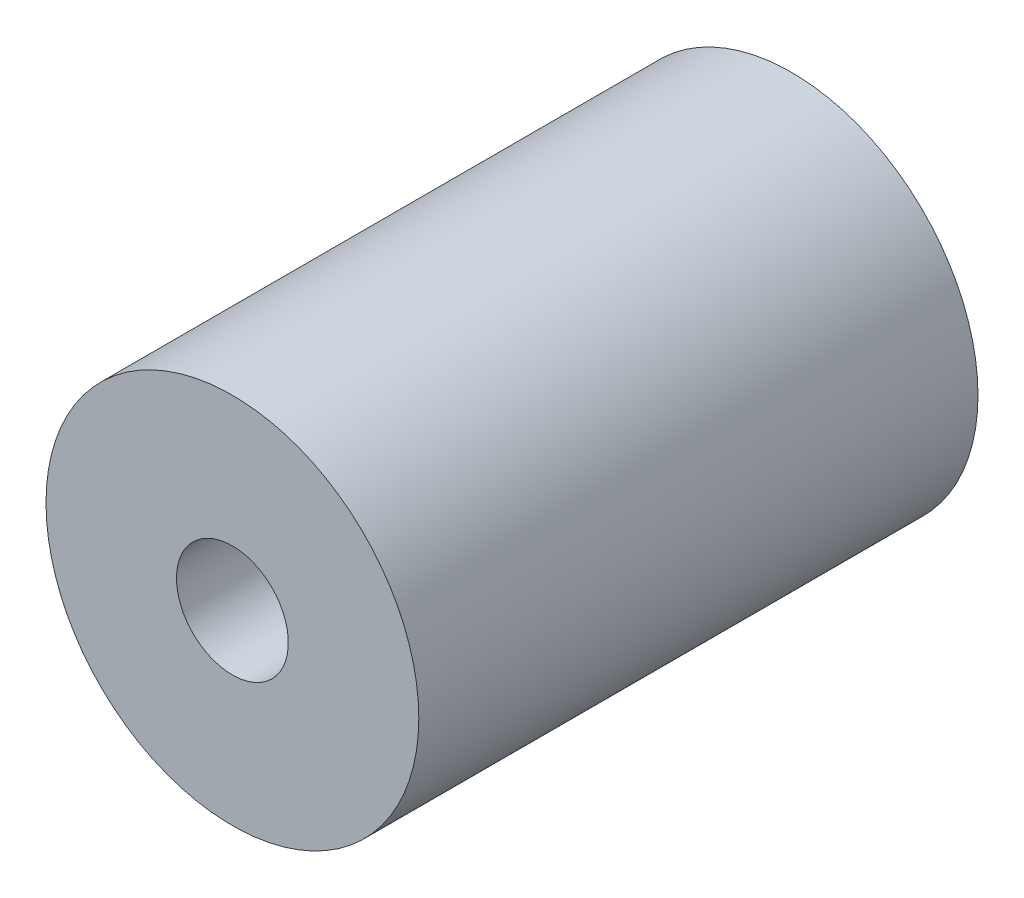
ISO-10303-21;
HEADER;
FILE_DESCRIPTION(('STEP AP214'),'2;1');
FILE_NAME('part.step','',(''),(''),'','','');
FILE_SCHEMA(('AUTOMOTIVE_DESIGN { 1 0 10303 214 1 1 1 1 }'));
ENDSEC;
DATA;
#1=APPLICATION_CONTEXT('core data for automotive mechanical design processes');
#2=APPLICATION_PROTOCOL_DEFINITION('international standard','automotive_design',2000,#1);
#3=PRODUCT_CONTEXT('',#1,'mechanical');
#4=PRODUCT('Part','Part','',(#3));
#5=PRODUCT_RELATED_PRODUCT_CATEGORY('part','',(#4));
#6=PRODUCT_DEFINITION_FORMATION('','',#4);
#7=PRODUCT_DEFINITION_CONTEXT('part definition',#1,'design');
#8=PRODUCT_DEFINITION('design','',#6,#7);
#9=PRODUCT_DEFINITION_SHAPE('','',#8);
#10=(LENGTH_UNIT() NAMED_UNIT(*) SI_UNIT(.MILLI.,.METRE.));
#11=(NAMED_UNIT(*) PLANE_ANGLE_UNIT() SI_UNIT($,.RADIAN.));
#12=(NAMED_UNIT(*) SI_UNIT($,.STERADIAN.) SOLID_ANGLE_UNIT());
#13=UNCERTAINTY_MEASURE_WITH_UNIT(LENGTH_MEASURE(1.E-05),#10,'distance_accuracy_value','');
#14=(GEOMETRIC_REPRESENTATION_CONTEXT(3) GLOBAL_UNCERTAINTY_ASSIGNED_CONTEXT((#13)) GLOBAL_UNIT_ASSIGNED_CONTEXT((#10,
#11,#12)) REPRESENTATION_CONTEXT('',''));
#15=CARTESIAN_POINT('',(0.,0.,0.));
#16=DIRECTION('',(0.,0.,1.));
#17=DIRECTION('',(1.,0.,0.));
#18=AXIS2_PLACEMENT_3D('',#15,#16,#17);
#19=CARTESIAN_POINT('',(4.99999999999999,0.,-15.));
#20=DIRECTION('',(0.,0.,1.));
#21=DIRECTION('',(1.,0.,0.));
#22=AXIS2_PLACEMENT_3D('',#19,#20,#21);
#23=PLANE('',#22);
#24=CARTESIAN_POINT('',(0.,0.,-15.));
#25=DIRECTION('',(0.,0.,-1.));
#26=DIRECTION('',(-1.,0.,0.));
#27=AXIS2_PLACEMENT_3D('',#24,#25,#26);
#28=CIRCLE('',#27,5.);
#29=CARTESIAN_POINT('',(-5.00000000000001,0.,-15.));
#30=VERTEX_POINT('',#29);
#31=EDGE_CURVE('E39',#30,#30,#28,.T.);
#32=ORIENTED_EDGE('',*,*,#31,.T.);
#33=EDGE_LOOP('',(#32));
#34=FACE_BOUND('',#33,.T.);
#35=CARTESIAN_POINT('',(0.,0.,-15.));
#36=DIRECTION('',(0.,0.,-1.));
#37=DIRECTION('',(-1.,0.,0.));
#38=AXIS2_PLACEMENT_3D('',#35,#36,#37);
#39=CIRCLE('',#38,1.5);
#40=CARTESIAN_POINT('',(-1.5,0.,-15.));
#41=VERTEX_POINT('',#40);
#42=EDGE_CURVE('E47',#41,#41,#39,.T.);
#43=ORIENTED_EDGE('',*,*,#42,.F.);
#44=EDGE_LOOP('',(#43));
#45=FACE_BOUND('',#44,.T.);
#46=ADVANCED_FACE('F32',(#34,#45),#23,.F.);
#47=CARTESIAN_POINT('',(0.,0.,0.));
#48=DIRECTION('',(0.,0.,-1.));
#49=DIRECTION('',(-1.,0.,0.));
#50=AXIS2_PLACEMENT_3D('',#47,#48,#49);
#51=PLANE('',#50);
#52=CARTESIAN_POINT('',(0.,0.,0.));
#53=DIRECTION('',(0.,0.,-1.));
#54=DIRECTION('',(-1.,0.,0.));
#55=AXIS2_PLACEMENT_3D('',#52,#53,#54);
#56=CIRCLE('',#55,1.5);
#57=CARTESIAN_POINT('',(-1.5,0.,0.));
#58=VERTEX_POINT('',#57);
#59=EDGE_CURVE('E43',#58,#58,#56,.T.);
#60=ORIENTED_EDGE('',*,*,#59,.T.);
#61=EDGE_LOOP('',(#60));
#62=FACE_BOUND('',#61,.T.);
#63=CARTESIAN_POINT('',(0.,0.,0.));
#64=DIRECTION('',(0.,0.,-1.));
#65=DIRECTION('',(-1.,0.,0.));
#66=AXIS2_PLACEMENT_3D('',#63,#64,#65);
#67=CIRCLE('',#66,5.);
#68=CARTESIAN_POINT('',(-5.,0.,0.));
#69=VERTEX_POINT('',#68);
#70=EDGE_CURVE('E10',#69,#69,#67,.T.);
#71=ORIENTED_EDGE('',*,*,#70,.F.);
#72=EDGE_LOOP('',(#71));
#73=FACE_BOUND('',#72,.T.);
#74=ADVANCED_FACE('F34',(#62,#73),#51,.F.);
#75=CARTESIAN_POINT('',(0.,0.,-15.));
#76=DIRECTION('',(0.,0.,-1.));
#77=DIRECTION('',(-1.,0.,0.));
#78=AXIS2_PLACEMENT_3D('',#75,#76,#77);
#79=CYLINDRICAL_SURFACE('',#78,5.);
#80=ORIENTED_EDGE('',*,*,#31,.F.);
#81=EDGE_LOOP('',(#80));
#82=FACE_BOUND('',#81,.T.);
#83=ORIENTED_EDGE('',*,*,#70,.T.);
#84=EDGE_LOOP('',(#83));
#85=FACE_BOUND('',#84,.T.);
#86=ADVANCED_FACE('F60',(#82,#85),#79,.T.);
#87=CARTESIAN_POINT('',(0.,0.,-15.));
#88=DIRECTION('',(0.,0.,-1.));
#89=DIRECTION('',(-1.,0.,0.));
#90=AXIS2_PLACEMENT_3D('',#87,#88,#89);
#91=CYLINDRICAL_SURFACE('',#90,1.5);
#92=ORIENTED_EDGE('',*,*,#59,.F.);
#93=EDGE_LOOP('',(#92));
#94=FACE_BOUND('',#93,.T.);
#95=ORIENTED_EDGE('',*,*,#42,.T.);
#96=EDGE_LOOP('',(#95));
#97=FACE_BOUND('',#96,.T.);
#98=ADVANCED_FACE('F53',(#94,#97),#91,.F.);
#99=CLOSED_SHELL('',(#46,#74,#86,#98));
#100=MANIFOLD_SOLID_BREP('B2',#99);
#101=ADVANCED_BREP_SHAPE_REPRESENTATION('',(#18,#100),#14);
#102=SHAPE_DEFINITION_REPRESENTATION(#9,#101);
ENDSEC;
END-ISO-10303-21;
